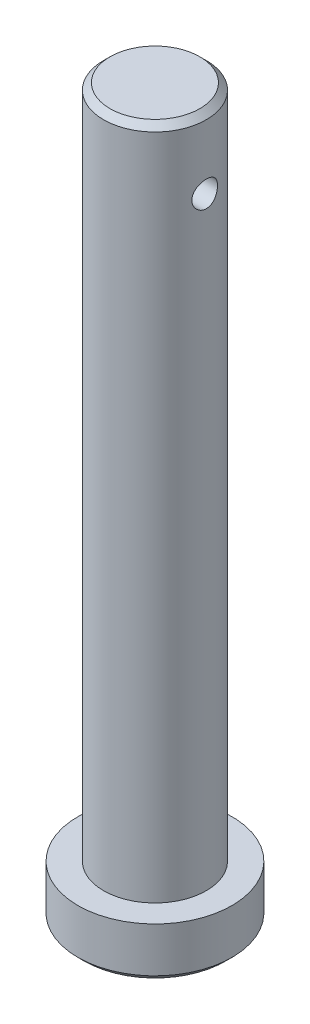
ISO-10303-21;
HEADER;
FILE_DESCRIPTION(('STEP AP214'),'2;1');
FILE_NAME('part.step','',(''),(''),'','','');
FILE_SCHEMA(('AUTOMOTIVE_DESIGN { 1 0 10303 214 1 1 1 1 }'));
ENDSEC;
DATA;
#1=APPLICATION_CONTEXT('core data for automotive mechanical design processes');
#2=APPLICATION_PROTOCOL_DEFINITION('international standard','automotive_design',2000,#1);
#3=PRODUCT_CONTEXT('',#1,'mechanical');
#4=PRODUCT('Part','Part','',(#3));
#5=PRODUCT_RELATED_PRODUCT_CATEGORY('part','',(#4));
#6=PRODUCT_DEFINITION_FORMATION('','',#4);
#7=PRODUCT_DEFINITION_CONTEXT('part definition',#1,'design');
#8=PRODUCT_DEFINITION('design','',#6,#7);
#9=PRODUCT_DEFINITION_SHAPE('','',#8);
#10=(LENGTH_UNIT() NAMED_UNIT(*) SI_UNIT(.MILLI.,.METRE.));
#11=(NAMED_UNIT(*) PLANE_ANGLE_UNIT() SI_UNIT($,.RADIAN.));
#12=(NAMED_UNIT(*) SI_UNIT($,.STERADIAN.) SOLID_ANGLE_UNIT());
#13=UNCERTAINTY_MEASURE_WITH_UNIT(LENGTH_MEASURE(1.E-05),#10,'distance_accuracy_value','');
#14=(GEOMETRIC_REPRESENTATION_CONTEXT(3) GLOBAL_UNCERTAINTY_ASSIGNED_CONTEXT((#13)) GLOBAL_UNIT_ASSIGNED_CONTEXT((#10,
#11,#12)) REPRESENTATION_CONTEXT('',''));
#15=CARTESIAN_POINT('',(0.,0.,0.));
#16=DIRECTION('',(0.,0.,1.));
#17=DIRECTION('',(1.,0.,0.));
#18=AXIS2_PLACEMENT_3D('',#15,#16,#17);
#19=CARTESIAN_POINT('',(0.,8.,0.));
#20=DIRECTION('',(0.,-1.,0.));
#21=DIRECTION('',(0.,0.,-1.));
#22=AXIS2_PLACEMENT_3D('',#19,#20,#21);
#23=CYLINDRICAL_SURFACE('',#22,12.);
#24=CARTESIAN_POINT('',(0.,1.,0.));
#25=DIRECTION('',(0.,1.,0.));
#26=DIRECTION('',(0.,0.,1.));
#27=AXIS2_PLACEMENT_3D('',#24,#25,#26);
#28=CIRCLE('',#27,12.);
#29=CARTESIAN_POINT('',(0.,1.,12.));
#30=VERTEX_POINT('',#29);
#31=EDGE_CURVE('E118',#30,#30,#28,.T.);
#32=ORIENTED_EDGE('',*,*,#31,.T.);
#33=EDGE_LOOP('',(#32));
#34=FACE_BOUND('',#33,.T.);
#35=CARTESIAN_POINT('',(0.,8.,0.));
#36=DIRECTION('',(0.,1.,0.));
#37=DIRECTION('',(0.,0.,1.));
#38=AXIS2_PLACEMENT_3D('',#35,#36,#37);
#39=CIRCLE('',#38,12.);
#40=CARTESIAN_POINT('',(0.,8.,12.));
#41=VERTEX_POINT('',#40);
#42=EDGE_CURVE('E120',#41,#41,#39,.T.);
#43=ORIENTED_EDGE('',*,*,#42,.F.);
#44=EDGE_LOOP('',(#43));
#45=FACE_BOUND('',#44,.T.);
#46=ADVANCED_FACE('F43',(#34,#45),#23,.T.);
#47=CARTESIAN_POINT('',(0.,8.,0.));
#48=DIRECTION('',(0.,1.,0.));
#49=DIRECTION('',(0.,0.,1.));
#50=AXIS2_PLACEMENT_3D('',#47,#48,#49);
#51=PLANE('',#50);
#52=CARTESIAN_POINT('',(0.,8.,0.));
#53=DIRECTION('',(0.,1.,0.));
#54=DIRECTION('',(0.,0.,1.));
#55=AXIS2_PLACEMENT_3D('',#52,#53,#54);
#56=CIRCLE('',#55,8.);
#57=CARTESIAN_POINT('',(0.,8.,8.));
#58=VERTEX_POINT('',#57);
#59=EDGE_CURVE('E64',#58,#58,#56,.T.);
#60=ORIENTED_EDGE('',*,*,#59,.F.);
#61=EDGE_LOOP('',(#60));
#62=FACE_BOUND('',#61,.T.);
#63=ORIENTED_EDGE('',*,*,#42,.T.);
#64=EDGE_LOOP('',(#63));
#65=FACE_BOUND('',#64,.T.);
#66=ADVANCED_FACE('F93',(#62,#65),#51,.T.);
#67=CARTESIAN_POINT('',(0.,0.,0.));
#68=DIRECTION('',(0.,1.,0.));
#69=DIRECTION('',(0.,0.,1.));
#70=AXIS2_PLACEMENT_3D('',#67,#68,#69);
#71=PLANE('',#70);
#72=CARTESIAN_POINT('',(0.,0.,0.));
#73=DIRECTION('',(0.,1.,0.));
#74=DIRECTION('',(0.,0.,1.));
#75=AXIS2_PLACEMENT_3D('',#72,#73,#74);
#76=CIRCLE('',#75,11.);
#77=CARTESIAN_POINT('',(0.,0.,11.));
#78=VERTEX_POINT('',#77);
#79=EDGE_CURVE('E116',#78,#78,#76,.F.);
#80=ORIENTED_EDGE('',*,*,#79,.T.);
#81=EDGE_LOOP('',(#80));
#82=FACE_BOUND('',#81,.T.);
#83=ADVANCED_FACE('F99',(#82),#71,.F.);
#84=CARTESIAN_POINT('',(0.,1.,0.));
#85=DIRECTION('',(0.,1.,0.));
#86=DIRECTION('',(0.,0.,1.));
#87=AXIS2_PLACEMENT_3D('',#84,#85,#86);
#88=CONICAL_SURFACE('',#87,12.,0.78539816339745);
#89=ORIENTED_EDGE('',*,*,#79,.F.);
#90=EDGE_LOOP('',(#89));
#91=FACE_BOUND('',#90,.T.);
#92=ORIENTED_EDGE('',*,*,#31,.F.);
#93=EDGE_LOOP('',(#92));
#94=FACE_BOUND('',#93,.T.);
#95=ADVANCED_FACE('F90',(#91,#94),#88,.T.);
#96=CARTESIAN_POINT('',(0.,113.,0.));
#97=DIRECTION('',(0.,-1.,0.));
#98=DIRECTION('',(0.,0.,-1.));
#99=AXIS2_PLACEMENT_3D('',#96,#97,#98);
#100=CYLINDRICAL_SURFACE('',#99,8.);
#101=CARTESIAN_POINT('',(-7.74596669241483,102.,-2.));
#102=CARTESIAN_POINT('',(-7.74596880070288,102.110440600741,-1.99999686287446));
#103=CARTESIAN_POINT('',(-7.74835444811678,102.220915918943,-1.99082099639812));
#104=CARTESIAN_POINT('',(-7.75761489594051,102.438694062539,-1.95441850037104));
#105=CARTESIAN_POINT('',(-7.76449230897304,102.545995003575,-1.92718136539369));
#106=CARTESIAN_POINT('',(-7.7819097967692,102.75424283055,-1.85559295970564));
#107=CARTESIAN_POINT('',(-7.79244514152366,102.855197724309,-1.8112637822836));
#108=CARTESIAN_POINT('',(-7.81598553623007,103.048248682032,-1.70681691300912));
#109=CARTESIAN_POINT('',(-7.82899069102791,103.140344369664,-1.64669855084855));
#110=CARTESIAN_POINT('',(-7.856325730845,103.31508931621,-1.5109667418495));
#111=CARTESIAN_POINT('',(-7.87067678098428,103.39751488028,-1.43506951016323));
#112=CARTESIAN_POINT('',(-7.89890300412235,103.548609115488,-1.27054565128052));
#113=CARTESIAN_POINT('',(-7.91277813253111,103.617276500497,-1.18191783534424));
#114=CARTESIAN_POINT('',(-7.93872332416466,103.739820374105,-0.992916160863164));
#115=CARTESIAN_POINT('',(-7.95076549920474,103.793477110529,-0.892395660956098));
#116=CARTESIAN_POINT('',(-7.97144649540787,103.883047715322,-0.683410547434213));
#117=CARTESIAN_POINT('',(-7.98008581867475,103.918964201532,-0.574947108633556));
#118=CARTESIAN_POINT('',(-7.99283807078544,103.971318267663,-0.355487007003335));
#119=CARTESIAN_POINT('',(-7.99703915075451,103.988135715461,-0.244586175639188));
#120=CARTESIAN_POINT('',(-8.00074875285838,104.00300670342,-0.0214630554102243));
#121=CARTESIAN_POINT('',(-8.00025796877363,104.001063017768,0.090759035630446));
#122=CARTESIAN_POINT('',(-7.99470475962828,103.9787401198,0.310704494344765));
#123=CARTESIAN_POINT('',(-7.98974401872699,103.958770939957,0.418472431202123));
#124=CARTESIAN_POINT('',(-7.97592669219883,103.901622983961,0.629076494827364));
#125=CARTESIAN_POINT('',(-7.96706989918753,103.864443291698,0.73191235874087));
#126=CARTESIAN_POINT('',(-7.94630007760717,103.77359794345,0.930813407003607));
#127=CARTESIAN_POINT('',(-7.93436015756043,103.719786364271,1.026809019533));
#128=CARTESIAN_POINT('',(-7.90871923047719,103.597315456707,1.20855124468097));
#129=CARTESIAN_POINT('',(-7.89501791721992,103.528653545152,1.294296070171));
#130=CARTESIAN_POINT('',(-7.86690971015616,103.376233006414,1.45554807016991));
#131=CARTESIAN_POINT('',(-7.85249375620734,103.292116086122,1.53071535815039));
#132=CARTESIAN_POINT('',(-7.82492034813365,103.112320021168,1.66595275192603));
#133=CARTESIAN_POINT('',(-7.81176295284777,103.016640336407,1.72602215209203));
#134=CARTESIAN_POINT('',(-7.78816397465319,102.815767972681,1.82957625804519));
#135=CARTESIAN_POINT('',(-7.77773586980577,102.710531415749,1.87297913394098));
#136=CARTESIAN_POINT('',(-7.76094912111966,102.493931625539,1.94137124127268));
#137=CARTESIAN_POINT('',(-7.75458960648175,102.382569708814,1.96636441310582));
#138=CARTESIAN_POINT('',(-7.74684284831312,102.160032398782,1.99666371093214));
#139=CARTESIAN_POINT('',(-7.74532871274918,102.048929765336,2.0024723791357));
#140=CARTESIAN_POINT('',(-7.74709874784831,101.827342450737,1.99561359241244));
#141=CARTESIAN_POINT('',(-7.75038247681013,101.716857713639,1.98294783827904));
#142=CARTESIAN_POINT('',(-7.76125665563648,101.501508588036,1.93994037115013));
#143=CARTESIAN_POINT('',(-7.768775761875,101.396581818743,1.9098912546254));
#144=CARTESIAN_POINT('',(-7.7872057461677,101.193254833719,1.8332944653365));
#145=CARTESIAN_POINT('',(-7.79811702598891,101.094855392756,1.78674483817004));
#146=CARTESIAN_POINT('',(-7.8223690967461,100.905246977706,1.67741653434925));
#147=CARTESIAN_POINT('',(-7.83575334885313,100.814216927966,1.61433740306851));
#148=CARTESIAN_POINT('',(-7.86333666457373,100.643849309759,1.47412058586891));
#149=CARTESIAN_POINT('',(-7.87753586182776,100.56451366668,1.39698058961088));
#150=CARTESIAN_POINT('',(-7.90557922425285,100.417751165943,1.22852544196945));
#151=CARTESIAN_POINT('',(-7.91940561649468,100.350671949961,1.13690390506318));
#152=CARTESIAN_POINT('',(-7.94477773290987,100.232851306439,0.943405365389354));
#153=CARTESIAN_POINT('',(-7.95632357603169,100.182109026713,0.84152889791519));
#154=CARTESIAN_POINT('',(-7.9757609259065,100.098843172378,0.631116403462193));
#155=CARTESIAN_POINT('',(-7.98367864017925,100.066188572497,0.522634762055775));
#156=CARTESIAN_POINT('',(-7.99508234716634,100.019631732313,0.301499520637621));
#157=CARTESIAN_POINT('',(-7.99856919514738,100.005725873009,0.188846730082486));
#158=CARTESIAN_POINT('',(-8.00068338817612,99.9972648208489,-0.0341670528866427));
#159=CARTESIAN_POINT('',(-7.99943957759977,100.002196581809,-0.144507653932039));
#160=CARTESIAN_POINT('',(-7.99251792914887,100.030095654589,-0.362734992829496));
#161=CARTESIAN_POINT('',(-7.98684022314338,100.053062430026,-0.470621803561852));
#162=CARTESIAN_POINT('',(-7.97170865707778,100.116104439542,-0.680342071289541));
#163=CARTESIAN_POINT('',(-7.96227529004785,100.156086906629,-0.782204989161717));
#164=CARTESIAN_POINT('',(-7.94062577827316,100.251941158039,-0.977834106083239));
#165=CARTESIAN_POINT('',(-7.92840928277515,100.307814945341,-1.07159928253126));
#166=CARTESIAN_POINT('',(-7.90214499360574,100.435430467992,-1.2508038568466));
#167=CARTESIAN_POINT('',(-7.88806033883329,100.507520285808,-1.33598997659666));
#168=CARTESIAN_POINT('',(-7.8598129811438,100.664845703955,-1.493230040547));
#169=CARTESIAN_POINT('',(-7.84565025934604,100.750084632222,-1.56528065015318));
#170=CARTESIAN_POINT('',(-7.81854951691005,100.933202828379,-1.69552405294366));
#171=CARTESIAN_POINT('',(-7.80563927346578,101.031288246731,-1.75343323883275));
#172=CARTESIAN_POINT('',(-7.78287910989656,101.23611097975,-1.85185379317093));
#173=CARTESIAN_POINT('',(-7.77302696466427,101.342841932188,-1.8923778195043));
#174=CARTESIAN_POINT('',(-7.75903817501475,101.54115402367,-1.94884505714201));
#175=CARTESIAN_POINT('',(-7.75417326006998,101.631786328772,-1.96798634119376));
#176=CARTESIAN_POINT('',(-7.7476367716524,101.814937737995,-1.99356458514354));
#177=CARTESIAN_POINT('',(-7.74596492578216,101.907456680489,-2.0000026287435));
#178=CARTESIAN_POINT('',(-7.74596669241483,102.,-2.));
#179=B_SPLINE_CURVE_WITH_KNOTS('',3,(#101,#102,#103,#104,#105,#106,#107,#108,#109,#110,#111,
#112,#113,#114,#115,#116,#117,#118,#119,#120,#121,#122,#123,#124,#125,#126,#127,#128,#129,#130,
#131,#132,#133,#134,#135,#136,#137,#138,#139,#140,#141,#142,#143,#144,#145,#146,#147,#148,#149,
#150,#151,#152,#153,#154,#155,#156,#157,#158,#159,#160,#161,#162,#163,#164,#165,#166,#167,#168,
#169,#170,#171,#172,#173,#174,#175,#176,#177,#178),.UNSPECIFIED.,.T.,.F.,(4,2,2,2,2,2,2,2,2,2,2,
2,2,2,2,2,2,2,2,2,2,2,2,2,2,2,2,2,2,2,2,2,2,2,2,2,2,2,4),(0.,0.330981953388903,
0.662156593142927,0.992904581732801,1.32366661404383,1.66099163354383,1.99834817183893,
2.34041197118336,2.68242527877673,3.01751000796276,3.35254518932816,3.68014610151157,
4.00776445379828,4.33834299403555,4.66897908375129,5.00856373257529,5.34816424959841,
5.6894114560672,6.03058560103639,6.36274859809374,6.69488101747041,7.02157924007365,
7.34831617137134,7.68146276687327,8.01466415108036,8.35620264772256,8.69772332575642,
9.03673658245543,9.37568439127231,9.70546756901965,10.0352409390158,10.3632390124777,
10.6912784459046,11.0271767726566,11.3631602525241,11.7054118182895,12.0474137709606,
12.3247826174462,12.6021278008238),.UNSPECIFIED.);
#180=CARTESIAN_POINT('',(-7.74596669241483,102.,-2.));
#181=VERTEX_POINT('',#180);
#182=EDGE_CURVE('E48',#181,#181,#179,.T.);
#183=ORIENTED_EDGE('',*,*,#182,.T.);
#184=EDGE_LOOP('',(#183));
#185=FACE_BOUND('',#184,.T.);
#186=CARTESIAN_POINT('',(7.74596669241483,102.,-2.));
#187=CARTESIAN_POINT('',(7.74596880070288,101.889559399259,-1.99999686287446));
#188=CARTESIAN_POINT('',(7.74835444811678,101.779084081057,-1.99082099639812));
#189=CARTESIAN_POINT('',(7.75761489594051,101.561305937461,-1.95441850037104));
#190=CARTESIAN_POINT('',(7.76449230897304,101.454004996425,-1.92718136539369));
#191=CARTESIAN_POINT('',(7.7819097967692,101.24575716945,-1.85559295970563));
#192=CARTESIAN_POINT('',(7.79244514152366,101.144802275691,-1.81126378228359));
#193=CARTESIAN_POINT('',(7.81598553623007,100.951751317968,-1.7068169130091));
#194=CARTESIAN_POINT('',(7.82899069102791,100.859655630336,-1.64669855084855));
#195=CARTESIAN_POINT('',(7.856325730845,100.68491068379,-1.51096674184951));
#196=CARTESIAN_POINT('',(7.87067678098427,100.60248511972,-1.43506951016325));
#197=CARTESIAN_POINT('',(7.89890300412235,100.451390884512,-1.27054565128053));
#198=CARTESIAN_POINT('',(7.91277813253111,100.382723499503,-1.18191783534425));
#199=CARTESIAN_POINT('',(7.93872332416466,100.260179625895,-0.992916160863164));
#200=CARTESIAN_POINT('',(7.95076549920474,100.206522889471,-0.892395660956098));
#201=CARTESIAN_POINT('',(7.97144649540787,100.116952284678,-0.683410547434213));
#202=CARTESIAN_POINT('',(7.98008581867475,100.081035798468,-0.574947108633556));
#203=CARTESIAN_POINT('',(7.99283807078544,100.028681732337,-0.355487007003335));
#204=CARTESIAN_POINT('',(7.99703915075451,100.011864284539,-0.244586175639187));
#205=CARTESIAN_POINT('',(8.00074875285838,99.9969932965796,-0.0214630554102231));
#206=CARTESIAN_POINT('',(8.00025796877363,99.9989369822323,0.0907590356304466));
#207=CARTESIAN_POINT('',(7.99470475962828,100.0212598802,0.310704494344766));
#208=CARTESIAN_POINT('',(7.98974401872699,100.041229060043,0.418472431202126));
#209=CARTESIAN_POINT('',(7.97592669219883,100.098377016039,0.629076494827366));
#210=CARTESIAN_POINT('',(7.96706989918753,100.135556708302,0.731912358740871));
#211=CARTESIAN_POINT('',(7.94630007760717,100.22640205655,0.930813407003607));
#212=CARTESIAN_POINT('',(7.93436015756043,100.280213635729,1.026809019533));
#213=CARTESIAN_POINT('',(7.90871923047719,100.402684543293,1.20855124468097));
#214=CARTESIAN_POINT('',(7.89501791721992,100.471346454849,1.294296070171));
#215=CARTESIAN_POINT('',(7.86690971015616,100.623766993586,1.45554807016991));
#216=CARTESIAN_POINT('',(7.85249375620734,100.707883913878,1.53071535815039));
#217=CARTESIAN_POINT('',(7.82492034813365,100.887679978832,1.66595275192603));
#218=CARTESIAN_POINT('',(7.81176295284777,100.983359663593,1.72602215209203));
#219=CARTESIAN_POINT('',(7.78816397465319,101.184232027319,1.8295762580452));
#220=CARTESIAN_POINT('',(7.77773586980577,101.289468584251,1.87297913394099));
#221=CARTESIAN_POINT('',(7.76094912111965,101.506068374461,1.94137124127268));
#222=CARTESIAN_POINT('',(7.75458960648175,101.617430291187,1.96636441310582));
#223=CARTESIAN_POINT('',(7.74684284831312,101.839967601219,1.99666371093214));
#224=CARTESIAN_POINT('',(7.74532871274918,101.951070234664,2.0024723791357));
#225=CARTESIAN_POINT('',(7.74709874784831,102.172657549263,1.99561359241244));
#226=CARTESIAN_POINT('',(7.75038247681013,102.283142286361,1.98294783827904));
#227=CARTESIAN_POINT('',(7.76125665563648,102.498491411964,1.93994037115013));
#228=CARTESIAN_POINT('',(7.768775761875,102.603418181257,1.9098912546254));
#229=CARTESIAN_POINT('',(7.7872057461677,102.806745166281,1.8332944653365));
#230=CARTESIAN_POINT('',(7.79811702598891,102.905144607244,1.78674483817004));
#231=CARTESIAN_POINT('',(7.8223690967461,103.094753022294,1.67741653434925));
#232=CARTESIAN_POINT('',(7.83575334885313,103.185783072034,1.61433740306851));
#233=CARTESIAN_POINT('',(7.86333666457373,103.356150690241,1.47412058586891));
#234=CARTESIAN_POINT('',(7.87753586182776,103.43548633332,1.39698058961088));
#235=CARTESIAN_POINT('',(7.90557922425285,103.582248834057,1.22852544196945));
#236=CARTESIAN_POINT('',(7.91940561649468,103.649328050039,1.13690390506319));
#237=CARTESIAN_POINT('',(7.94477773290987,103.767148693561,0.943405365389359));
#238=CARTESIAN_POINT('',(7.95632357603169,103.817890973287,0.841528897915192));
#239=CARTESIAN_POINT('',(7.9757609259065,103.901156827622,0.631116403462192));
#240=CARTESIAN_POINT('',(7.98367864017925,103.933811427503,0.522634762055775));
#241=CARTESIAN_POINT('',(7.99508234716634,103.980368267687,0.301499520637622));
#242=CARTESIAN_POINT('',(7.99856919514738,103.994274126991,0.188846730082486));
#243=CARTESIAN_POINT('',(8.00068338817612,104.002735179151,-0.0341670528866427));
#244=CARTESIAN_POINT('',(7.99943957759977,103.997803418191,-0.144507653932039));
#245=CARTESIAN_POINT('',(7.99251792914887,103.969904345411,-0.362734992829496));
#246=CARTESIAN_POINT('',(7.98684022314338,103.946937569974,-0.470621803561851));
#247=CARTESIAN_POINT('',(7.97170865707778,103.883895560458,-0.680342071289543));
#248=CARTESIAN_POINT('',(7.96227529004785,103.843913093371,-0.782204989161721));
#249=CARTESIAN_POINT('',(7.94062577827316,103.748058841961,-0.977834106083243));
#250=CARTESIAN_POINT('',(7.92840928277515,103.692185054659,-1.07159928253126));
#251=CARTESIAN_POINT('',(7.90214499360574,103.564569532008,-1.2508038568466));
#252=CARTESIAN_POINT('',(7.88806033883329,103.492479714192,-1.33598997659666));
#253=CARTESIAN_POINT('',(7.8598129811438,103.335154296045,-1.493230040547));
#254=CARTESIAN_POINT('',(7.84565025934604,103.249915367778,-1.56528065015318));
#255=CARTESIAN_POINT('',(7.81854951691005,103.066797171621,-1.69552405294366));
#256=CARTESIAN_POINT('',(7.80563927346578,102.96871175327,-1.75343323883275));
#257=CARTESIAN_POINT('',(7.78287910989656,102.76388902025,-1.85185379317094));
#258=CARTESIAN_POINT('',(7.77302696466427,102.657158067812,-1.8923778195043));
#259=CARTESIAN_POINT('',(7.75903817501475,102.45884597633,-1.94884505714201));
#260=CARTESIAN_POINT('',(7.75417326006998,102.368213671228,-1.96798634119376));
#261=CARTESIAN_POINT('',(7.7476367716524,102.185062262005,-1.99356458514354));
#262=CARTESIAN_POINT('',(7.74596492578216,102.092543319511,-2.0000026287435));
#263=CARTESIAN_POINT('',(7.74596669241483,102.,-2.));
#264=B_SPLINE_CURVE_WITH_KNOTS('',3,(#186,#187,#188,#189,#190,#191,#192,#193,#194,#195,#196,
#197,#198,#199,#200,#201,#202,#203,#204,#205,#206,#207,#208,#209,#210,#211,#212,#213,#214,#215,
#216,#217,#218,#219,#220,#221,#222,#223,#224,#225,#226,#227,#228,#229,#230,#231,#232,#233,#234,
#235,#236,#237,#238,#239,#240,#241,#242,#243,#244,#245,#246,#247,#248,#249,#250,#251,#252,#253,
#254,#255,#256,#257,#258,#259,#260,#261,#262,#263),.UNSPECIFIED.,.T.,.F.,(4,2,2,2,2,2,2,2,2,2,2,
2,2,2,2,2,2,2,2,2,2,2,2,2,2,2,2,2,2,2,2,2,2,2,2,2,2,2,4),(0.,0.330981953388903,
0.662156593142927,0.992904581732833,1.32366661404383,1.6609916335438,1.99834817183893,
2.34041197118336,2.68242527877673,3.01751000796277,3.35254518932816,3.68014610151157,
4.00776445379828,4.33834299403555,4.66897908375129,5.0085637325753,5.34816424959841,
5.68941145606723,6.03058560103639,6.36274859809374,6.69488101747041,7.02157924007365,
7.34831617137134,7.68146276687327,8.01466415108036,8.35620264772255,8.69772332575642,
9.03673658245543,9.37568439127231,9.70546756901966,10.0352409390158,10.3632390124777,
10.6912784459046,11.0271767726566,11.3631602525241,11.7054118182895,12.0474137709606,
12.3247826174462,12.6021278008238),.UNSPECIFIED.);
#265=CARTESIAN_POINT('',(7.74596669241483,102.,-2.));
#266=VERTEX_POINT('',#265);
#267=EDGE_CURVE('E67',#266,#266,#264,.T.);
#268=ORIENTED_EDGE('',*,*,#267,.T.);
#269=EDGE_LOOP('',(#268));
#270=FACE_BOUND('',#269,.T.);
#271=CARTESIAN_POINT('',(0.,112.,0.));
#272=DIRECTION('',(0.,1.,0.));
#273=DIRECTION('',(0.,0.,1.));
#274=AXIS2_PLACEMENT_3D('',#271,#272,#273);
#275=CIRCLE('',#274,8.);
#276=CARTESIAN_POINT('',(0.,112.,8.));
#277=VERTEX_POINT('',#276);
#278=EDGE_CURVE('E10',#277,#277,#275,.F.);
#279=ORIENTED_EDGE('',*,*,#278,.T.);
#280=EDGE_LOOP('',(#279));
#281=FACE_BOUND('',#280,.T.);
#282=ORIENTED_EDGE('',*,*,#59,.T.);
#283=EDGE_LOOP('',(#282));
#284=FACE_BOUND('',#283,.T.);
#285=ADVANCED_FACE('F73',(#185,#270,#281,#284),#100,.T.);
#286=CARTESIAN_POINT('',(0.,113.,0.));
#287=DIRECTION('',(0.,1.,0.));
#288=DIRECTION('',(0.,0.,1.));
#289=AXIS2_PLACEMENT_3D('',#286,#287,#288);
#290=PLANE('',#289);
#291=CARTESIAN_POINT('',(0.,113.,0.));
#292=DIRECTION('',(0.,1.,0.));
#293=DIRECTION('',(0.,0.,1.));
#294=AXIS2_PLACEMENT_3D('',#291,#292,#293);
#295=CIRCLE('',#294,7.00000000000001);
#296=CARTESIAN_POINT('',(0.,113.,7.00000000000001));
#297=VERTEX_POINT('',#296);
#298=EDGE_CURVE('E58',#297,#297,#295,.T.);
#299=ORIENTED_EDGE('',*,*,#298,.T.);
#300=EDGE_LOOP('',(#299));
#301=FACE_BOUND('',#300,.T.);
#302=ADVANCED_FACE('F81',(#301),#290,.T.);
#303=CARTESIAN_POINT('',(0.,113.,0.));
#304=DIRECTION('',(0.,-1.,0.));
#305=DIRECTION('',(0.,0.,-1.));
#306=AXIS2_PLACEMENT_3D('',#303,#304,#305);
#307=CONICAL_SURFACE('',#306,7.00000000000001,0.785398163397445);
#308=ORIENTED_EDGE('',*,*,#278,.F.);
#309=EDGE_LOOP('',(#308));
#310=FACE_BOUND('',#309,.T.);
#311=ORIENTED_EDGE('',*,*,#298,.F.);
#312=EDGE_LOOP('',(#311));
#313=FACE_BOUND('',#312,.T.);
#314=ADVANCED_FACE('F46',(#310,#313),#307,.T.);
#315=CARTESIAN_POINT('',(-52.5,102.,0.));
#316=DIRECTION('',(1.,0.,0.));
#317=DIRECTION('',(0.,0.,-1.));
#318=AXIS2_PLACEMENT_3D('',#315,#316,#317);
#319=CYLINDRICAL_SURFACE('',#318,2.);
#320=ORIENTED_EDGE('',*,*,#267,.F.);
#321=EDGE_LOOP('',(#320));
#322=FACE_BOUND('',#321,.T.);
#323=ORIENTED_EDGE('',*,*,#182,.F.);
#324=EDGE_LOOP('',(#323));
#325=FACE_BOUND('',#324,.T.);
#326=ADVANCED_FACE('F77',(#322,#325),#319,.F.);
#327=CLOSED_SHELL('',(#46,#66,#83,#95,#285,#302,#314,#326));
#328=MANIFOLD_SOLID_BREP('B2',#327);
#329=ADVANCED_BREP_SHAPE_REPRESENTATION('',(#18,#328),#14);
#330=SHAPE_DEFINITION_REPRESENTATION(#9,#329);
ENDSEC;
END-ISO-10303-21;
